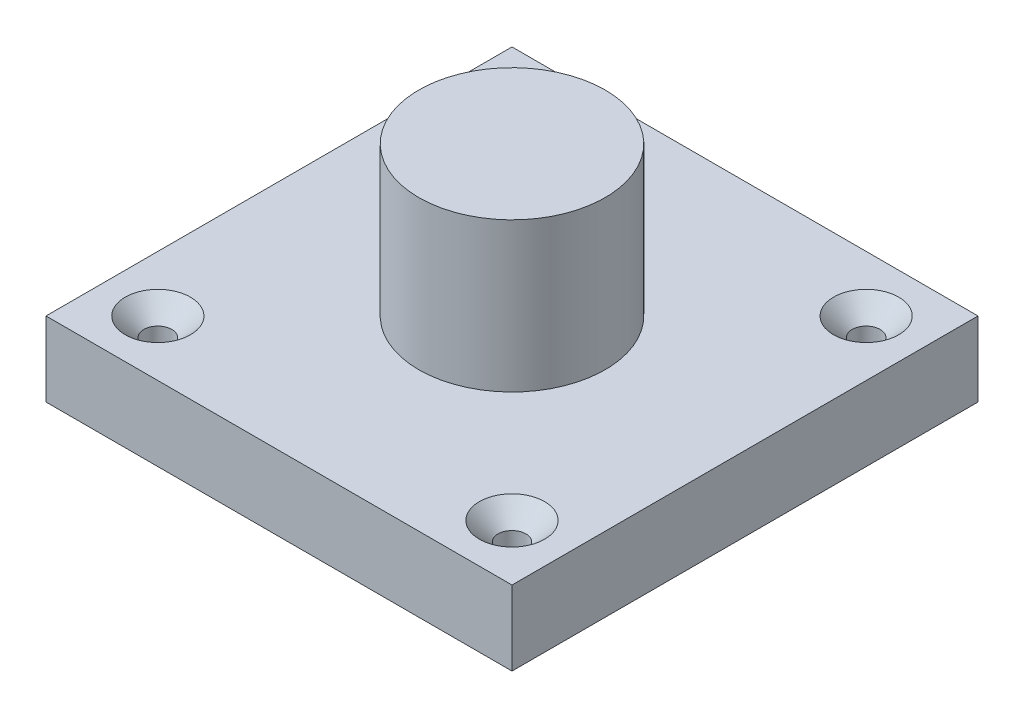
ISO-10303-21;
HEADER;
FILE_DESCRIPTION(('STEP AP214'),'2;1');
FILE_NAME('part.step','',(''),(''),'','','');
FILE_SCHEMA(('AUTOMOTIVE_DESIGN { 1 0 10303 214 1 1 1 1 }'));
ENDSEC;
DATA;
#1=APPLICATION_CONTEXT('core data for automotive mechanical design processes');
#2=APPLICATION_PROTOCOL_DEFINITION('international standard','automotive_design',2000,#1);
#3=PRODUCT_CONTEXT('',#1,'mechanical');
#4=PRODUCT('Part','Part','',(#3));
#5=PRODUCT_RELATED_PRODUCT_CATEGORY('part','',(#4));
#6=PRODUCT_DEFINITION_FORMATION('','',#4);
#7=PRODUCT_DEFINITION_CONTEXT('part definition',#1,'design');
#8=PRODUCT_DEFINITION('design','',#6,#7);
#9=PRODUCT_DEFINITION_SHAPE('','',#8);
#10=(LENGTH_UNIT() NAMED_UNIT(*) SI_UNIT(.MILLI.,.METRE.));
#11=(NAMED_UNIT(*) PLANE_ANGLE_UNIT() SI_UNIT($,.RADIAN.));
#12=(NAMED_UNIT(*) SI_UNIT($,.STERADIAN.) SOLID_ANGLE_UNIT());
#13=UNCERTAINTY_MEASURE_WITH_UNIT(LENGTH_MEASURE(1.E-05),#10,'distance_accuracy_value','');
#14=(GEOMETRIC_REPRESENTATION_CONTEXT(3) GLOBAL_UNCERTAINTY_ASSIGNED_CONTEXT((#13)) GLOBAL_UNIT_ASSIGNED_CONTEXT((#10,
#11,#12)) REPRESENTATION_CONTEXT('',''));
#15=CARTESIAN_POINT('',(0.,0.,0.));
#16=DIRECTION('',(0.,0.,1.));
#17=DIRECTION('',(1.,0.,0.));
#18=AXIS2_PLACEMENT_3D('',#15,#16,#17);
#19=CARTESIAN_POINT('',(25.,8.,25.));
#20=DIRECTION('',(-1.,0.,0.));
#21=DIRECTION('',(0.,0.,1.));
#22=AXIS2_PLACEMENT_3D('',#19,#20,#21);
#23=PLANE('',#22);
#24=DIRECTION('',(0.,0.,-1.));
#25=VECTOR('',#24,1.);
#26=CARTESIAN_POINT('',(25.,0.,25.));
#27=LINE('',#26,#25);
#28=CARTESIAN_POINT('',(25.,0.,25.));
#29=VERTEX_POINT('',#28);
#30=CARTESIAN_POINT('',(25.,0.,-25.));
#31=VERTEX_POINT('',#30);
#32=EDGE_CURVE('E103',#29,#31,#27,.T.);
#33=ORIENTED_EDGE('',*,*,#32,.T.);
#34=DIRECTION('',(0.,-1.,0.));
#35=VECTOR('',#34,1.);
#36=CARTESIAN_POINT('',(25.,8.,-25.));
#37=LINE('',#36,#35);
#38=CARTESIAN_POINT('',(25.,8.,-25.));
#39=VERTEX_POINT('',#38);
#40=EDGE_CURVE('E94',#39,#31,#37,.T.);
#41=ORIENTED_EDGE('',*,*,#40,.F.);
#42=DIRECTION('',(0.,0.,-1.));
#43=VECTOR('',#42,1.);
#44=CARTESIAN_POINT('',(25.,8.,25.));
#45=LINE('',#44,#43);
#46=CARTESIAN_POINT('',(25.,8.,25.));
#47=VERTEX_POINT('',#46);
#48=EDGE_CURVE('E88',#47,#39,#45,.T.);
#49=ORIENTED_EDGE('',*,*,#48,.F.);
#50=DIRECTION('',(0.,-1.,0.));
#51=VECTOR('',#50,1.);
#52=CARTESIAN_POINT('',(25.,8.,25.));
#53=LINE('',#52,#51);
#54=EDGE_CURVE('E99',#47,#29,#53,.T.);
#55=ORIENTED_EDGE('',*,*,#54,.T.);
#56=EDGE_LOOP('',(#33,#41,#49,#55));
#57=FACE_BOUND('',#56,.T.);
#58=ADVANCED_FACE('F34',(#57),#23,.F.);
#59=CARTESIAN_POINT('',(-25.,8.,-25.));
#60=DIRECTION('',(0.,0.,1.));
#61=DIRECTION('',(1.,0.,0.));
#62=AXIS2_PLACEMENT_3D('',#59,#60,#61);
#63=PLANE('',#62);
#64=DIRECTION('',(-1.,0.,0.));
#65=VECTOR('',#64,1.);
#66=CARTESIAN_POINT('',(-25.,0.,-25.));
#67=LINE('',#66,#65);
#68=CARTESIAN_POINT('',(-25.,0.,-25.));
#69=VERTEX_POINT('',#68);
#70=EDGE_CURVE('E93',#31,#69,#67,.T.);
#71=ORIENTED_EDGE('',*,*,#70,.T.);
#72=DIRECTION('',(0.,-1.,0.));
#73=VECTOR('',#72,1.);
#74=CARTESIAN_POINT('',(-25.,8.,-25.));
#75=LINE('',#74,#73);
#76=CARTESIAN_POINT('',(-25.,8.,-25.));
#77=VERTEX_POINT('',#76);
#78=EDGE_CURVE('E91',#77,#69,#75,.T.);
#79=ORIENTED_EDGE('',*,*,#78,.F.);
#80=DIRECTION('',(-1.,0.,0.));
#81=VECTOR('',#80,1.);
#82=CARTESIAN_POINT('',(-25.,8.,-25.));
#83=LINE('',#82,#81);
#84=EDGE_CURVE('E83',#39,#77,#83,.T.);
#85=ORIENTED_EDGE('',*,*,#84,.F.);
#86=ORIENTED_EDGE('',*,*,#40,.T.);
#87=EDGE_LOOP('',(#71,#79,#85,#86));
#88=FACE_BOUND('',#87,.T.);
#89=ADVANCED_FACE('F92',(#88),#63,.F.);
#90=CARTESIAN_POINT('',(-25.,8.,25.));
#91=DIRECTION('',(1.,0.,0.));
#92=DIRECTION('',(0.,0.,-1.));
#93=AXIS2_PLACEMENT_3D('',#90,#91,#92);
#94=PLANE('',#93);
#95=DIRECTION('',(0.,0.,1.));
#96=VECTOR('',#95,1.);
#97=CARTESIAN_POINT('',(-25.,0.,25.));
#98=LINE('',#97,#96);
#99=CARTESIAN_POINT('',(-25.,0.,25.));
#100=VERTEX_POINT('',#99);
#101=EDGE_CURVE('E69',#69,#100,#98,.T.);
#102=ORIENTED_EDGE('',*,*,#101,.T.);
#103=DIRECTION('',(0.,-1.,0.));
#104=VECTOR('',#103,1.);
#105=CARTESIAN_POINT('',(-25.,8.,25.));
#106=LINE('',#105,#104);
#107=CARTESIAN_POINT('',(-25.,8.,25.));
#108=VERTEX_POINT('',#107);
#109=EDGE_CURVE('E95',#108,#100,#106,.T.);
#110=ORIENTED_EDGE('',*,*,#109,.F.);
#111=DIRECTION('',(0.,0.,1.));
#112=VECTOR('',#111,1.);
#113=CARTESIAN_POINT('',(-25.,8.,25.));
#114=LINE('',#113,#112);
#115=EDGE_CURVE('E86',#77,#108,#114,.T.);
#116=ORIENTED_EDGE('',*,*,#115,.F.);
#117=ORIENTED_EDGE('',*,*,#78,.T.);
#118=EDGE_LOOP('',(#102,#110,#116,#117));
#119=FACE_BOUND('',#118,.T.);
#120=ADVANCED_FACE('F97',(#119),#94,.F.);
#121=CARTESIAN_POINT('',(-25.,8.,25.));
#122=DIRECTION('',(0.,0.,-1.));
#123=DIRECTION('',(-1.,0.,0.));
#124=AXIS2_PLACEMENT_3D('',#121,#122,#123);
#125=PLANE('',#124);
#126=DIRECTION('',(1.,0.,0.));
#127=VECTOR('',#126,1.);
#128=CARTESIAN_POINT('',(-25.,0.,25.));
#129=LINE('',#128,#127);
#130=EDGE_CURVE('E75',#100,#29,#129,.T.);
#131=ORIENTED_EDGE('',*,*,#130,.T.);
#132=ORIENTED_EDGE('',*,*,#54,.F.);
#133=DIRECTION('',(1.,0.,0.));
#134=VECTOR('',#133,1.);
#135=CARTESIAN_POINT('',(-25.,8.,25.));
#136=LINE('',#135,#134);
#137=EDGE_CURVE('E52',#108,#47,#136,.T.);
#138=ORIENTED_EDGE('',*,*,#137,.F.);
#139=ORIENTED_EDGE('',*,*,#109,.T.);
#140=EDGE_LOOP('',(#131,#132,#138,#139));
#141=FACE_BOUND('',#140,.T.);
#142=ADVANCED_FACE('F208',(#141),#125,.F.);
#143=CARTESIAN_POINT('',(0.,8.,0.));
#144=DIRECTION('',(0.,-1.,0.));
#145=DIRECTION('',(0.,0.,-1.));
#146=AXIS2_PLACEMENT_3D('',#143,#144,#145);
#147=PLANE('',#146);
#148=CARTESIAN_POINT('',(-19.0000000000002,8.,-18.9999999999998));
#149=DIRECTION('',(0.,-1.,0.));
#150=DIRECTION('',(0.,0.,-1.));
#151=AXIS2_PLACEMENT_3D('',#148,#149,#150);
#152=CIRCLE('',#151,3.5);
#153=CARTESIAN_POINT('',(-19.0000000000002,8.,-22.4999999999998));
#154=VERTEX_POINT('',#153);
#155=EDGE_CURVE('E11',#154,#154,#152,.T.);
#156=ORIENTED_EDGE('',*,*,#155,.T.);
#157=EDGE_LOOP('',(#156));
#158=FACE_BOUND('',#157,.T.);
#159=CARTESIAN_POINT('',(19.,8.,-19.));
#160=DIRECTION('',(0.,-1.,0.));
#161=DIRECTION('',(0.,0.,-1.));
#162=AXIS2_PLACEMENT_3D('',#159,#160,#161);
#163=CIRCLE('',#162,3.5);
#164=CARTESIAN_POINT('',(19.,8.,-22.5));
#165=VERTEX_POINT('',#164);
#166=EDGE_CURVE('E129',#165,#165,#163,.T.);
#167=ORIENTED_EDGE('',*,*,#166,.T.);
#168=EDGE_LOOP('',(#167));
#169=FACE_BOUND('',#168,.T.);
#170=CARTESIAN_POINT('',(19.0000000000001,8.,18.9999999999999));
#171=DIRECTION('',(0.,-1.,0.));
#172=DIRECTION('',(0.,0.,-1.));
#173=AXIS2_PLACEMENT_3D('',#170,#171,#172);
#174=CIRCLE('',#173,3.5);
#175=CARTESIAN_POINT('',(19.0000000000001,8.,15.4999999999999));
#176=VERTEX_POINT('',#175);
#177=EDGE_CURVE('E123',#176,#176,#174,.T.);
#178=ORIENTED_EDGE('',*,*,#177,.T.);
#179=EDGE_LOOP('',(#178));
#180=FACE_BOUND('',#179,.T.);
#181=CARTESIAN_POINT('',(-19.,8.,19.));
#182=DIRECTION('',(0.,-1.,0.));
#183=DIRECTION('',(0.,0.,-1.));
#184=AXIS2_PLACEMENT_3D('',#181,#182,#183);
#185=CIRCLE('',#184,3.5);
#186=CARTESIAN_POINT('',(-19.,8.,15.5));
#187=VERTEX_POINT('',#186);
#188=EDGE_CURVE('E117',#187,#187,#185,.T.);
#189=ORIENTED_EDGE('',*,*,#188,.T.);
#190=EDGE_LOOP('',(#189));
#191=FACE_BOUND('',#190,.T.);
#192=CARTESIAN_POINT('',(0.,8.,0.));
#193=DIRECTION('',(0.,1.,0.));
#194=DIRECTION('',(0.,0.,1.));
#195=AXIS2_PLACEMENT_3D('',#192,#193,#194);
#196=CIRCLE('',#195,10.);
#197=CARTESIAN_POINT('',(0.,8.,10.));
#198=VERTEX_POINT('',#197);
#199=EDGE_CURVE('E113',#198,#198,#196,.T.);
#200=ORIENTED_EDGE('',*,*,#199,.F.);
#201=EDGE_LOOP('',(#200));
#202=FACE_BOUND('',#201,.T.);
#203=ORIENTED_EDGE('',*,*,#48,.T.);
#204=ORIENTED_EDGE('',*,*,#84,.T.);
#205=ORIENTED_EDGE('',*,*,#115,.T.);
#206=ORIENTED_EDGE('',*,*,#137,.T.);
#207=EDGE_LOOP('',(#203,#204,#205,#206));
#208=FACE_BOUND('',#207,.T.);
#209=ADVANCED_FACE('F84',(#158,#169,#180,#191,#202,#208),#147,.F.);
#210=CARTESIAN_POINT('',(0.,0.,0.));
#211=DIRECTION('',(0.,-1.,0.));
#212=DIRECTION('',(0.,0.,-1.));
#213=AXIS2_PLACEMENT_3D('',#210,#211,#212);
#214=PLANE('',#213);
#215=CARTESIAN_POINT('',(19.0000000000001,0.,18.9999999999999));
#216=DIRECTION('',(0.,1.,0.));
#217=DIRECTION('',(1.,0.,0.));
#218=AXIS2_PLACEMENT_3D('',#215,#216,#217);
#219=CIRCLE('',#218,1.5);
#220=CARTESIAN_POINT('',(20.5000000000001,0.,18.9999999999999));
#221=VERTEX_POINT('',#220);
#222=EDGE_CURVE('E186',#221,#221,#219,.T.);
#223=ORIENTED_EDGE('',*,*,#222,.T.);
#224=EDGE_LOOP('',(#223));
#225=FACE_BOUND('',#224,.T.);
#226=CARTESIAN_POINT('',(19.,0.,-19.));
#227=DIRECTION('',(0.,1.,0.));
#228=DIRECTION('',(0.,0.,-1.));
#229=AXIS2_PLACEMENT_3D('',#226,#227,#228);
#230=CIRCLE('',#229,1.5);
#231=CARTESIAN_POINT('',(19.,0.,-20.5));
#232=VERTEX_POINT('',#231);
#233=EDGE_CURVE('E189',#232,#232,#230,.T.);
#234=ORIENTED_EDGE('',*,*,#233,.T.);
#235=EDGE_LOOP('',(#234));
#236=FACE_BOUND('',#235,.T.);
#237=CARTESIAN_POINT('',(-19.0000000000002,0.,-18.9999999999998));
#238=DIRECTION('',(0.,1.,0.));
#239=DIRECTION('',(-1.,0.,0.));
#240=AXIS2_PLACEMENT_3D('',#237,#238,#239);
#241=CIRCLE('',#240,1.5);
#242=CARTESIAN_POINT('',(-20.5000000000002,0.,-18.9999999999998));
#243=VERTEX_POINT('',#242);
#244=EDGE_CURVE('E194',#243,#243,#241,.T.);
#245=ORIENTED_EDGE('',*,*,#244,.T.);
#246=EDGE_LOOP('',(#245));
#247=FACE_BOUND('',#246,.T.);
#248=CARTESIAN_POINT('',(-19.,0.,19.));
#249=DIRECTION('',(0.,1.,0.));
#250=DIRECTION('',(0.,0.,1.));
#251=AXIS2_PLACEMENT_3D('',#248,#249,#250);
#252=CIRCLE('',#251,1.5);
#253=CARTESIAN_POINT('',(-19.,0.,20.5));
#254=VERTEX_POINT('',#253);
#255=EDGE_CURVE('E188',#254,#254,#252,.T.);
#256=ORIENTED_EDGE('',*,*,#255,.T.);
#257=EDGE_LOOP('',(#256));
#258=FACE_BOUND('',#257,.T.);
#259=ORIENTED_EDGE('',*,*,#32,.F.);
#260=ORIENTED_EDGE('',*,*,#130,.F.);
#261=ORIENTED_EDGE('',*,*,#101,.F.);
#262=ORIENTED_EDGE('',*,*,#70,.F.);
#263=EDGE_LOOP('',(#259,#260,#261,#262));
#264=FACE_BOUND('',#263,.T.);
#265=ADVANCED_FACE('F207',(#225,#236,#247,#258,#264),#214,.T.);
#266=CARTESIAN_POINT('',(0.,24.,0.));
#267=DIRECTION('',(0.,-1.,0.));
#268=DIRECTION('',(0.,0.,-1.));
#269=AXIS2_PLACEMENT_3D('',#266,#267,#268);
#270=CYLINDRICAL_SURFACE('',#269,10.);
#271=CARTESIAN_POINT('',(0.,24.,0.));
#272=DIRECTION('',(0.,1.,0.));
#273=DIRECTION('',(0.,0.,1.));
#274=AXIS2_PLACEMENT_3D('',#271,#272,#273);
#275=CIRCLE('',#274,10.);
#276=CARTESIAN_POINT('',(0.,24.,10.));
#277=VERTEX_POINT('',#276);
#278=EDGE_CURVE('E106',#277,#277,#275,.T.);
#279=ORIENTED_EDGE('',*,*,#278,.F.);
#280=EDGE_LOOP('',(#279));
#281=FACE_BOUND('',#280,.T.);
#282=ORIENTED_EDGE('',*,*,#199,.T.);
#283=EDGE_LOOP('',(#282));
#284=FACE_BOUND('',#283,.T.);
#285=ADVANCED_FACE('F204',(#281,#284),#270,.T.);
#286=CARTESIAN_POINT('',(0.,24.,0.));
#287=DIRECTION('',(0.,1.,0.));
#288=DIRECTION('',(0.,0.,1.));
#289=AXIS2_PLACEMENT_3D('',#286,#287,#288);
#290=PLANE('',#289);
#291=ORIENTED_EDGE('',*,*,#278,.T.);
#292=EDGE_LOOP('',(#291));
#293=FACE_BOUND('',#292,.T.);
#294=ADVANCED_FACE('F239',(#293),#290,.T.);
#295=CARTESIAN_POINT('',(-19.,0.,19.));
#296=DIRECTION('',(0.,1.,0.));
#297=DIRECTION('',(0.,0.,1.));
#298=AXIS2_PLACEMENT_3D('',#295,#296,#297);
#299=CYLINDRICAL_SURFACE('',#298,1.5);
#300=CARTESIAN_POINT('',(-19.,6.00000000000001,19.));
#301=DIRECTION('',(0.,-1.,0.));
#302=DIRECTION('',(0.,0.,-1.));
#303=AXIS2_PLACEMENT_3D('',#300,#301,#302);
#304=CIRCLE('',#303,1.5);
#305=CARTESIAN_POINT('',(-19.,6.00000000000001,17.5));
#306=VERTEX_POINT('',#305);
#307=EDGE_CURVE('E114',#306,#306,#304,.F.);
#308=ORIENTED_EDGE('',*,*,#307,.T.);
#309=EDGE_LOOP('',(#308));
#310=FACE_BOUND('',#309,.T.);
#311=ORIENTED_EDGE('',*,*,#255,.F.);
#312=EDGE_LOOP('',(#311));
#313=FACE_BOUND('',#312,.T.);
#314=ADVANCED_FACE('F162',(#310,#313),#299,.F.);
#315=CARTESIAN_POINT('',(-19.,6.00000000000001,19.));
#316=DIRECTION('',(0.,1.,0.));
#317=DIRECTION('',(0.,0.,1.));
#318=AXIS2_PLACEMENT_3D('',#315,#316,#317);
#319=CONICAL_SURFACE('',#318,1.5,0.785398163397448);
#320=ORIENTED_EDGE('',*,*,#188,.F.);
#321=EDGE_LOOP('',(#320));
#322=FACE_BOUND('',#321,.T.);
#323=ORIENTED_EDGE('',*,*,#307,.F.);
#324=EDGE_LOOP('',(#323));
#325=FACE_BOUND('',#324,.T.);
#326=ADVANCED_FACE('F156',(#322,#325),#319,.F.);
#327=CARTESIAN_POINT('',(-19.0000000000002,0.,-18.9999999999998));
#328=DIRECTION('',(0.,1.,0.));
#329=DIRECTION('',(0.,0.,1.));
#330=AXIS2_PLACEMENT_3D('',#327,#328,#329);
#331=CYLINDRICAL_SURFACE('',#330,1.5);
#332=CARTESIAN_POINT('',(-19.0000000000002,6.00000000000001,-18.9999999999998));
#333=DIRECTION('',(0.,-1.,0.));
#334=DIRECTION('',(0.,0.,-1.));
#335=AXIS2_PLACEMENT_3D('',#332,#333,#334);
#336=CIRCLE('',#335,1.5);
#337=CARTESIAN_POINT('',(-19.0000000000002,6.00000000000001,-20.4999999999998));
#338=VERTEX_POINT('',#337);
#339=EDGE_CURVE('E44',#338,#338,#336,.F.);
#340=ORIENTED_EDGE('',*,*,#339,.T.);
#341=EDGE_LOOP('',(#340));
#342=FACE_BOUND('',#341,.T.);
#343=ORIENTED_EDGE('',*,*,#244,.F.);
#344=EDGE_LOOP('',(#343));
#345=FACE_BOUND('',#344,.T.);
#346=ADVANCED_FACE('F134',(#342,#345),#331,.F.);
#347=CARTESIAN_POINT('',(19.,0.,-19.));
#348=DIRECTION('',(0.,1.,0.));
#349=DIRECTION('',(0.,0.,1.));
#350=AXIS2_PLACEMENT_3D('',#347,#348,#349);
#351=CYLINDRICAL_SURFACE('',#350,1.5);
#352=CARTESIAN_POINT('',(19.,6.00000000000001,-19.));
#353=DIRECTION('',(0.,-1.,0.));
#354=DIRECTION('',(0.,0.,-1.));
#355=AXIS2_PLACEMENT_3D('',#352,#353,#354);
#356=CIRCLE('',#355,1.5);
#357=CARTESIAN_POINT('',(19.,6.00000000000001,-20.5));
#358=VERTEX_POINT('',#357);
#359=EDGE_CURVE('E126',#358,#358,#356,.F.);
#360=ORIENTED_EDGE('',*,*,#359,.T.);
#361=EDGE_LOOP('',(#360));
#362=FACE_BOUND('',#361,.T.);
#363=ORIENTED_EDGE('',*,*,#233,.F.);
#364=EDGE_LOOP('',(#363));
#365=FACE_BOUND('',#364,.T.);
#366=ADVANCED_FACE('F177',(#362,#365),#351,.F.);
#367=CARTESIAN_POINT('',(19.0000000000001,0.,18.9999999999999));
#368=DIRECTION('',(0.,1.,0.));
#369=DIRECTION('',(0.,0.,1.));
#370=AXIS2_PLACEMENT_3D('',#367,#368,#369);
#371=CYLINDRICAL_SURFACE('',#370,1.5);
#372=CARTESIAN_POINT('',(19.0000000000001,6.00000000000001,18.9999999999999));
#373=DIRECTION('',(0.,-1.,0.));
#374=DIRECTION('',(0.,0.,-1.));
#375=AXIS2_PLACEMENT_3D('',#372,#373,#374);
#376=CIRCLE('',#375,1.5);
#377=CARTESIAN_POINT('',(19.0000000000001,6.00000000000001,17.4999999999999));
#378=VERTEX_POINT('',#377);
#379=EDGE_CURVE('E120',#378,#378,#376,.F.);
#380=ORIENTED_EDGE('',*,*,#379,.T.);
#381=EDGE_LOOP('',(#380));
#382=FACE_BOUND('',#381,.T.);
#383=ORIENTED_EDGE('',*,*,#222,.F.);
#384=EDGE_LOOP('',(#383));
#385=FACE_BOUND('',#384,.T.);
#386=ADVANCED_FACE('F168',(#382,#385),#371,.F.);
#387=CARTESIAN_POINT('',(19.0000000000001,6.00000000000001,18.9999999999999));
#388=DIRECTION('',(0.,1.,0.));
#389=DIRECTION('',(0.,0.,1.));
#390=AXIS2_PLACEMENT_3D('',#387,#388,#389);
#391=CONICAL_SURFACE('',#390,1.5,0.785398163397448);
#392=ORIENTED_EDGE('',*,*,#177,.F.);
#393=EDGE_LOOP('',(#392));
#394=FACE_BOUND('',#393,.T.);
#395=ORIENTED_EDGE('',*,*,#379,.F.);
#396=EDGE_LOOP('',(#395));
#397=FACE_BOUND('',#396,.T.);
#398=ADVANCED_FACE('F143',(#394,#397),#391,.F.);
#399=CARTESIAN_POINT('',(19.,6.00000000000001,-19.));
#400=DIRECTION('',(0.,1.,0.));
#401=DIRECTION('',(0.,0.,1.));
#402=AXIS2_PLACEMENT_3D('',#399,#400,#401);
#403=CONICAL_SURFACE('',#402,1.5,0.785398163397448);
#404=ORIENTED_EDGE('',*,*,#166,.F.);
#405=EDGE_LOOP('',(#404));
#406=FACE_BOUND('',#405,.T.);
#407=ORIENTED_EDGE('',*,*,#359,.F.);
#408=EDGE_LOOP('',(#407));
#409=FACE_BOUND('',#408,.T.);
#410=ADVANCED_FACE('F138',(#406,#409),#403,.F.);
#411=CARTESIAN_POINT('',(-19.0000000000002,6.00000000000001,-18.9999999999998));
#412=DIRECTION('',(0.,1.,0.));
#413=DIRECTION('',(0.,0.,1.));
#414=AXIS2_PLACEMENT_3D('',#411,#412,#413);
#415=CONICAL_SURFACE('',#414,1.5,0.785398163397448);
#416=ORIENTED_EDGE('',*,*,#155,.F.);
#417=EDGE_LOOP('',(#416));
#418=FACE_BOUND('',#417,.T.);
#419=ORIENTED_EDGE('',*,*,#339,.F.);
#420=EDGE_LOOP('',(#419));
#421=FACE_BOUND('',#420,.T.);
#422=ADVANCED_FACE('F37',(#418,#421),#415,.F.);
#423=CLOSED_SHELL('',(#58,#89,#120,#142,#209,#265,#285,#294,#314,#326,#346,#366,#386,#398,#410,#422));
#424=MANIFOLD_SOLID_BREP('B2',#423);
#425=ADVANCED_BREP_SHAPE_REPRESENTATION('',(#18,#424),#14);
#426=SHAPE_DEFINITION_REPRESENTATION(#9,#425);
ENDSEC;
END-ISO-10303-21;
